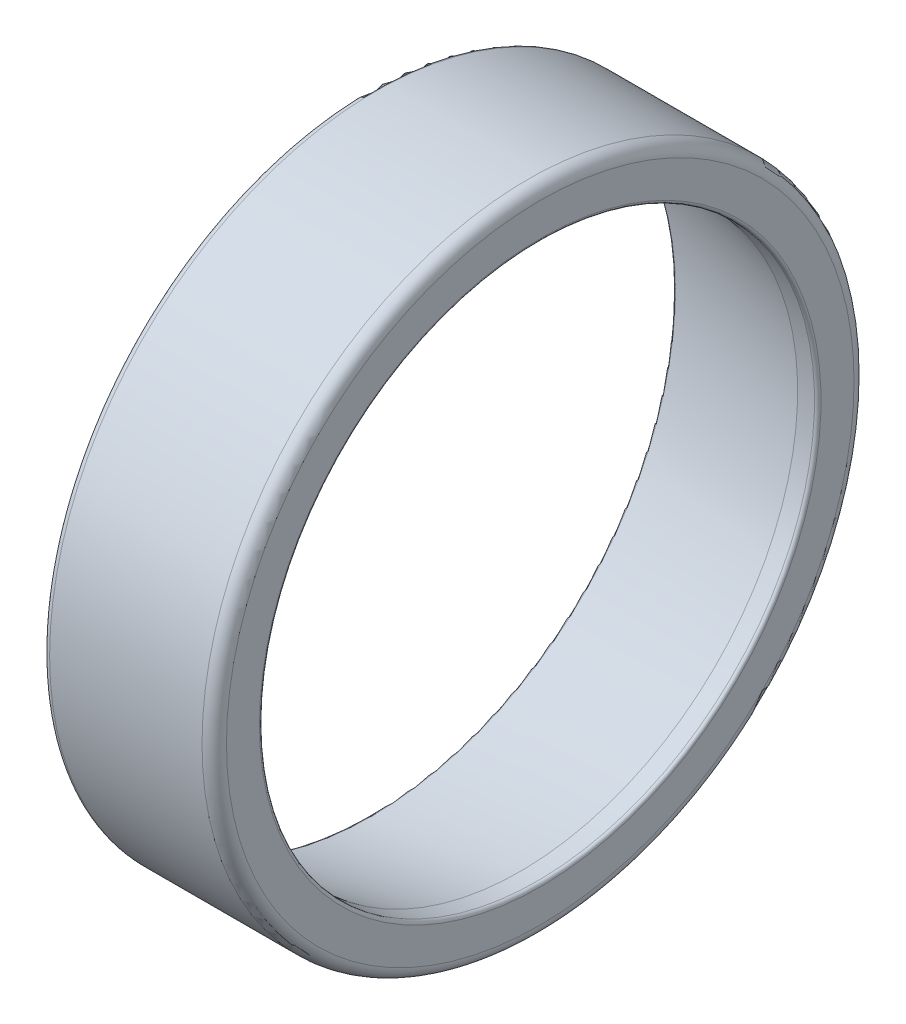
ISO-10303-21;
HEADER;
FILE_DESCRIPTION(('STEP AP214'),'2;1');
FILE_NAME('part.step','',(''),(''),'','','');
FILE_SCHEMA(('AUTOMOTIVE_DESIGN { 1 0 10303 214 1 1 1 1 }'));
ENDSEC;
DATA;
#1=APPLICATION_CONTEXT('core data for automotive mechanical design processes');
#2=APPLICATION_PROTOCOL_DEFINITION('international standard','automotive_design',2000,#1);
#3=PRODUCT_CONTEXT('',#1,'mechanical');
#4=PRODUCT('Part','Part','',(#3));
#5=PRODUCT_RELATED_PRODUCT_CATEGORY('part','',(#4));
#6=PRODUCT_DEFINITION_FORMATION('','',#4);
#7=PRODUCT_DEFINITION_CONTEXT('part definition',#1,'design');
#8=PRODUCT_DEFINITION('design','',#6,#7);
#9=PRODUCT_DEFINITION_SHAPE('','',#8);
#10=(LENGTH_UNIT() NAMED_UNIT(*) SI_UNIT(.MILLI.,.METRE.));
#11=(NAMED_UNIT(*) PLANE_ANGLE_UNIT() SI_UNIT($,.RADIAN.));
#12=(NAMED_UNIT(*) SI_UNIT($,.STERADIAN.) SOLID_ANGLE_UNIT());
#13=UNCERTAINTY_MEASURE_WITH_UNIT(LENGTH_MEASURE(1.E-05),#10,'distance_accuracy_value','');
#14=(GEOMETRIC_REPRESENTATION_CONTEXT(3) GLOBAL_UNCERTAINTY_ASSIGNED_CONTEXT((#13)) GLOBAL_UNIT_ASSIGNED_CONTEXT((#10,
#11,#12)) REPRESENTATION_CONTEXT('',''));
#15=CARTESIAN_POINT('',(0.,0.,0.));
#16=DIRECTION('',(0.,0.,1.));
#17=DIRECTION('',(1.,0.,0.));
#18=AXIS2_PLACEMENT_3D('',#15,#16,#17);
#19=CARTESIAN_POINT('',(1.,37.3176725808076,0.));
#20=DIRECTION('',(1.,0.,0.));
#21=DIRECTION('',(0.,0.,-1.));
#22=AXIS2_PLACEMENT_3D('',#19,#20,#21);
#23=PLANE('',#22);
#24=CARTESIAN_POINT('',(1.,0.,0.));
#25=DIRECTION('',(1.,0.,0.));
#26=DIRECTION('',(0.,0.,-1.));
#27=AXIS2_PLACEMENT_3D('',#24,#25,#26);
#28=CIRCLE('',#27,37.6533124332785);
#29=CARTESIAN_POINT('',(1.,0.,-37.6533124332785));
#30=VERTEX_POINT('',#29);
#31=EDGE_CURVE('E44',#30,#30,#28,.T.);
#32=ORIENTED_EDGE('',*,*,#31,.T.);
#33=EDGE_LOOP('',(#32));
#34=FACE_BOUND('',#33,.T.);
#35=CARTESIAN_POINT('',(1.,0.,0.));
#36=DIRECTION('',(1.,0.,0.));
#37=DIRECTION('',(0.,0.,-1.));
#38=AXIS2_PLACEMENT_3D('',#35,#36,#37);
#39=CIRCLE('',#38,39.2);
#40=CARTESIAN_POINT('',(1.,0.,-39.2));
#41=VERTEX_POINT('',#40);
#42=EDGE_CURVE('E56',#41,#41,#39,.F.);
#43=ORIENTED_EDGE('',*,*,#42,.T.);
#44=EDGE_LOOP('',(#43));
#45=FACE_BOUND('',#44,.T.);
#46=ADVANCED_FACE('F33',(#34,#45),#23,.F.);
#47=CARTESIAN_POINT('',(1.,0.,0.));
#48=DIRECTION('',(-1.,0.,0.));
#49=DIRECTION('',(0.,0.,1.));
#50=AXIS2_PLACEMENT_3D('',#47,#48,#49);
#51=CONICAL_SURFACE('',#50,37.3176725808076,0.174532925199533);
#52=CARTESIAN_POINT('',(1.33054072893321,0.,0.));
#53=DIRECTION('',(1.,0.,0.));
#54=DIRECTION('',(0.,0.,-1.));
#55=AXIS2_PLACEMENT_3D('',#52,#53,#54);
#56=CIRCLE('',#55,37.2593893320736);
#57=CARTESIAN_POINT('',(1.33054072893321,0.,-37.2593893320736));
#58=VERTEX_POINT('',#57);
#59=EDGE_CURVE('E48',#58,#58,#56,.F.);
#60=ORIENTED_EDGE('',*,*,#59,.T.);
#61=EDGE_LOOP('',(#60));
#62=FACE_BOUND('',#61,.T.);
#63=CARTESIAN_POINT('',(19.5318920999869,0.,0.));
#64=DIRECTION('',(-1.,0.,0.));
#65=DIRECTION('',(0.,0.,1.));
#66=AXIS2_PLACEMENT_3D('',#63,#64,#65);
#67=CIRCLE('',#66,34.05);
#68=CARTESIAN_POINT('',(19.5318920999869,0.,34.05));
#69=VERTEX_POINT('',#68);
#70=EDGE_CURVE('E65',#69,#69,#67,.T.);
#71=ORIENTED_EDGE('',*,*,#70,.F.);
#72=EDGE_LOOP('',(#71));
#73=FACE_BOUND('',#72,.T.);
#74=ADVANCED_FACE('F71',(#62,#73),#51,.F.);
#75=CARTESIAN_POINT('',(0.,0.,0.));
#76=DIRECTION('',(-1.,0.,0.));
#77=DIRECTION('',(0.,0.,1.));
#78=AXIS2_PLACEMENT_3D('',#75,#76,#77);
#79=CYLINDRICAL_SURFACE('',#78,34.05);
#80=CARTESIAN_POINT('',(21.6,0.,0.));
#81=DIRECTION('',(-1.,0.,0.));
#82=DIRECTION('',(0.,0.,1.));
#83=AXIS2_PLACEMENT_3D('',#80,#81,#82);
#84=CIRCLE('',#83,34.05);
#85=CARTESIAN_POINT('',(21.6,0.,34.05));
#86=VERTEX_POINT('',#85);
#87=EDGE_CURVE('E10',#86,#86,#84,.F.);
#88=ORIENTED_EDGE('',*,*,#87,.T.);
#89=EDGE_LOOP('',(#88));
#90=FACE_BOUND('',#89,.T.);
#91=ORIENTED_EDGE('',*,*,#70,.T.);
#92=EDGE_LOOP('',(#91));
#93=FACE_BOUND('',#92,.T.);
#94=ADVANCED_FACE('F69',(#90,#93),#79,.F.);
#95=CARTESIAN_POINT('',(22.,34.05,0.));
#96=DIRECTION('',(-1.,0.,0.));
#97=DIRECTION('',(0.,0.,1.));
#98=AXIS2_PLACEMENT_3D('',#95,#96,#97);
#99=PLANE('',#98);
#100=CARTESIAN_POINT('',(22.,0.,0.));
#101=DIRECTION('',(-1.,0.,0.));
#102=DIRECTION('',(0.,0.,1.));
#103=AXIS2_PLACEMENT_3D('',#100,#101,#102);
#104=CIRCLE('',#103,34.45);
#105=CARTESIAN_POINT('',(22.,0.,34.45));
#106=VERTEX_POINT('',#105);
#107=EDGE_CURVE('E40',#106,#106,#104,.T.);
#108=ORIENTED_EDGE('',*,*,#107,.T.);
#109=EDGE_LOOP('',(#108));
#110=FACE_BOUND('',#109,.T.);
#111=CARTESIAN_POINT('',(22.,0.,0.));
#112=DIRECTION('',(-1.,0.,0.));
#113=DIRECTION('',(0.,0.,1.));
#114=AXIS2_PLACEMENT_3D('',#111,#112,#113);
#115=CIRCLE('',#114,38.5);
#116=CARTESIAN_POINT('',(22.,0.,38.5));
#117=VERTEX_POINT('',#116);
#118=EDGE_CURVE('E59',#117,#117,#115,.F.);
#119=ORIENTED_EDGE('',*,*,#118,.T.);
#120=EDGE_LOOP('',(#119));
#121=FACE_BOUND('',#120,.T.);
#122=ADVANCED_FACE('F79',(#110,#121),#99,.F.);
#123=CARTESIAN_POINT('',(0.,0.,0.));
#124=DIRECTION('',(-1.,0.,0.));
#125=DIRECTION('',(0.,0.,1.));
#126=AXIS2_PLACEMENT_3D('',#123,#124,#125);
#127=CYLINDRICAL_SURFACE('',#126,40.);
#128=CARTESIAN_POINT('',(1.8,0.,0.));
#129=DIRECTION('',(1.,0.,0.));
#130=DIRECTION('',(0.,0.,-1.));
#131=AXIS2_PLACEMENT_3D('',#128,#129,#130);
#132=CIRCLE('',#131,40.);
#133=CARTESIAN_POINT('',(1.8,0.,-40.));
#134=VERTEX_POINT('',#133);
#135=EDGE_CURVE('E53',#134,#134,#132,.T.);
#136=ORIENTED_EDGE('',*,*,#135,.T.);
#137=EDGE_LOOP('',(#136));
#138=FACE_BOUND('',#137,.T.);
#139=CARTESIAN_POINT('',(20.5,0.,0.));
#140=DIRECTION('',(-1.,0.,0.));
#141=DIRECTION('',(0.,0.,1.));
#142=AXIS2_PLACEMENT_3D('',#139,#140,#141);
#143=CIRCLE('',#142,40.);
#144=CARTESIAN_POINT('',(20.5,0.,40.));
#145=VERTEX_POINT('',#144);
#146=EDGE_CURVE('E62',#145,#145,#143,.T.);
#147=ORIENTED_EDGE('',*,*,#146,.T.);
#148=EDGE_LOOP('',(#147));
#149=FACE_BOUND('',#148,.T.);
#150=ADVANCED_FACE('F89',(#138,#149),#127,.T.);
#151=CARTESIAN_POINT('',(20.5,0.,0.));
#152=DIRECTION('',(-1.,0.,0.));
#153=DIRECTION('',(0.,0.,1.));
#154=AXIS2_PLACEMENT_3D('',#151,#152,#153);
#155=TOROIDAL_SURFACE('',#154,38.5,1.5);
#156=ORIENTED_EDGE('',*,*,#118,.F.);
#157=EDGE_LOOP('',(#156));
#158=FACE_BOUND('',#157,.T.);
#159=ORIENTED_EDGE('',*,*,#146,.F.);
#160=EDGE_LOOP('',(#159));
#161=FACE_BOUND('',#160,.T.);
#162=ADVANCED_FACE('F85',(#158,#161),#155,.T.);
#163=CARTESIAN_POINT('',(1.8,0.,0.));
#164=DIRECTION('',(1.,0.,0.));
#165=DIRECTION('',(0.,0.,-1.));
#166=AXIS2_PLACEMENT_3D('',#163,#164,#165);
#167=TOROIDAL_SURFACE('',#166,39.2,0.8);
#168=ORIENTED_EDGE('',*,*,#135,.F.);
#169=EDGE_LOOP('',(#168));
#170=FACE_BOUND('',#169,.T.);
#171=ORIENTED_EDGE('',*,*,#42,.F.);
#172=EDGE_LOOP('',(#171));
#173=FACE_BOUND('',#172,.T.);
#174=ADVANCED_FACE('F88',(#170,#173),#167,.T.);
#175=CARTESIAN_POINT('',(1.4,0.,0.));
#176=DIRECTION('',(1.,0.,0.));
#177=DIRECTION('',(0.,0.,-1.));
#178=AXIS2_PLACEMENT_3D('',#175,#176,#177);
#179=TOROIDAL_SURFACE('',#178,37.6533124332785,0.4);
#180=ORIENTED_EDGE('',*,*,#31,.F.);
#181=EDGE_LOOP('',(#180));
#182=FACE_BOUND('',#181,.T.);
#183=ORIENTED_EDGE('',*,*,#59,.F.);
#184=EDGE_LOOP('',(#183));
#185=FACE_BOUND('',#184,.T.);
#186=ADVANCED_FACE('F92',(#182,#185),#179,.T.);
#187=CARTESIAN_POINT('',(21.6,0.,0.));
#188=DIRECTION('',(-1.,0.,0.));
#189=DIRECTION('',(0.,0.,1.));
#190=AXIS2_PLACEMENT_3D('',#187,#188,#189);
#191=TOROIDAL_SURFACE('',#190,34.45,0.4);
#192=ORIENTED_EDGE('',*,*,#87,.F.);
#193=EDGE_LOOP('',(#192));
#194=FACE_BOUND('',#193,.T.);
#195=ORIENTED_EDGE('',*,*,#107,.F.);
#196=EDGE_LOOP('',(#195));
#197=FACE_BOUND('',#196,.T.);
#198=ADVANCED_FACE('F35',(#194,#197),#191,.T.);
#199=CLOSED_SHELL('',(#46,#74,#94,#122,#150,#162,#174,#186,#198));
#200=MANIFOLD_SOLID_BREP('B2',#199);
#201=ADVANCED_BREP_SHAPE_REPRESENTATION('',(#18,#200),#14);
#202=SHAPE_DEFINITION_REPRESENTATION(#9,#201);
ENDSEC;
END-ISO-10303-21;
